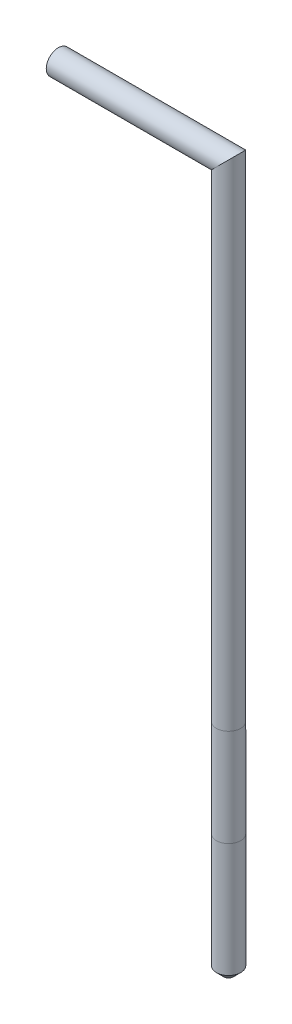
ISO-10303-21;
HEADER;
FILE_DESCRIPTION(('STEP AP214'),'2;1');
FILE_NAME('part.step','',(''),(''),'','','');
FILE_SCHEMA(('AUTOMOTIVE_DESIGN { 1 0 10303 214 1 1 1 1 }'));
ENDSEC;
DATA;
#1=APPLICATION_CONTEXT('core data for automotive mechanical design processes');
#2=APPLICATION_PROTOCOL_DEFINITION('international standard','automotive_design',2000,#1);
#3=PRODUCT_CONTEXT('',#1,'mechanical');
#4=PRODUCT('Part','Part','',(#3));
#5=PRODUCT_RELATED_PRODUCT_CATEGORY('part','',(#4));
#6=PRODUCT_DEFINITION_FORMATION('','',#4);
#7=PRODUCT_DEFINITION_CONTEXT('part definition',#1,'design');
#8=PRODUCT_DEFINITION('design','',#6,#7);
#9=PRODUCT_DEFINITION_SHAPE('','',#8);
#10=(LENGTH_UNIT() NAMED_UNIT(*) SI_UNIT(.MILLI.,.METRE.));
#11=(NAMED_UNIT(*) PLANE_ANGLE_UNIT() SI_UNIT($,.RADIAN.));
#12=(NAMED_UNIT(*) SI_UNIT($,.STERADIAN.) SOLID_ANGLE_UNIT());
#13=UNCERTAINTY_MEASURE_WITH_UNIT(LENGTH_MEASURE(1.E-05),#10,'distance_accuracy_value','');
#14=(GEOMETRIC_REPRESENTATION_CONTEXT(3) GLOBAL_UNCERTAINTY_ASSIGNED_CONTEXT((#13)) GLOBAL_UNIT_ASSIGNED_CONTEXT((#10,
#11,#12)) REPRESENTATION_CONTEXT('',''));
#15=CARTESIAN_POINT('',(0.,0.,0.));
#16=DIRECTION('',(0.,0.,1.));
#17=DIRECTION('',(1.,0.,0.));
#18=AXIS2_PLACEMENT_3D('',#15,#16,#17);
#19=CARTESIAN_POINT('',(0.,-50.,0.));
#20=DIRECTION('',(0.,1.,0.));
#21=DIRECTION('',(0.,0.,1.));
#22=AXIS2_PLACEMENT_3D('',#19,#20,#21);
#23=PLANE('',#22);
#24=CARTESIAN_POINT('',(0.,-50.,0.));
#25=DIRECTION('',(0.,1.,0.));
#26=DIRECTION('',(0.,0.,1.));
#27=AXIS2_PLACEMENT_3D('',#24,#25,#26);
#28=CIRCLE('',#27,2.);
#29=CARTESIAN_POINT('',(0.,-50.,2.));
#30=VERTEX_POINT('',#29);
#31=EDGE_CURVE('E10',#30,#30,#28,.F.);
#32=ORIENTED_EDGE('',*,*,#31,.T.);
#33=EDGE_LOOP('',(#32));
#34=FACE_BOUND('',#33,.T.);
#35=ADVANCED_FACE('F32',(#34),#23,.F.);
#36=CARTESIAN_POINT('',(-70.,240.,0.));
#37=DIRECTION('',(-1.,0.,0.));
#38=DIRECTION('',(0.,0.,1.));
#39=AXIS2_PLACEMENT_3D('',#36,#37,#38);
#40=PLANE('',#39);
#41=CARTESIAN_POINT('',(-70.,240.,0.));
#42=DIRECTION('',(-1.,0.,0.));
#43=DIRECTION('',(0.,0.,1.));
#44=AXIS2_PLACEMENT_3D('',#41,#42,#43);
#45=CIRCLE('',#44,5.);
#46=CARTESIAN_POINT('',(-70.,240.,5.));
#47=VERTEX_POINT('',#46);
#48=EDGE_CURVE('E48',#47,#47,#45,.T.);
#49=ORIENTED_EDGE('',*,*,#48,.T.);
#50=EDGE_LOOP('',(#49));
#51=FACE_BOUND('',#50,.T.);
#52=ADVANCED_FACE('F60',(#51),#40,.T.);
#53=CARTESIAN_POINT('',(0.,251.1,0.));
#54=DIRECTION('',(0.,-1.,0.));
#55=DIRECTION('',(0.,0.,-1.));
#56=AXIS2_PLACEMENT_3D('',#53,#54,#55);
#57=CYLINDRICAL_SURFACE('',#56,5.);
#58=CARTESIAN_POINT('',(0.,240.,0.));
#59=DIRECTION('',(0.707106781186548,-0.707106781186548,0.));
#60=DIRECTION('',(0.707106781186548,0.707106781186548,0.));
#61=AXIS2_PLACEMENT_3D('',#58,#59,#60);
#62=ELLIPSE('',#61,7.07106781186547,5.);
#63=CARTESIAN_POINT('',(5.,245.,0.));
#64=VERTEX_POINT('',#63);
#65=EDGE_CURVE('E44',#64,#64,#62,.T.);
#66=ORIENTED_EDGE('',*,*,#65,.T.);
#67=EDGE_LOOP('',(#66));
#68=FACE_BOUND('',#67,.T.);
#69=CARTESIAN_POINT('',(0.,40.,0.));
#70=DIRECTION('',(0.,1.,0.));
#71=DIRECTION('',(0.,0.,1.));
#72=AXIS2_PLACEMENT_3D('',#69,#70,#71);
#73=CIRCLE('',#72,5.);
#74=CARTESIAN_POINT('',(0.,40.,5.));
#75=VERTEX_POINT('',#74);
#76=EDGE_CURVE('E51',#75,#75,#73,.T.);
#77=ORIENTED_EDGE('',*,*,#76,.T.);
#78=EDGE_LOOP('',(#77));
#79=FACE_BOUND('',#78,.T.);
#80=ADVANCED_FACE('F69',(#68,#79),#57,.T.);
#81=CARTESIAN_POINT('',(0.,40.,0.));
#82=DIRECTION('',(0.,-1.,0.));
#83=DIRECTION('',(0.,0.,-1.));
#84=AXIS2_PLACEMENT_3D('',#81,#82,#83);
#85=CYLINDRICAL_SURFACE('',#84,5.);
#86=CARTESIAN_POINT('',(0.,0.,0.));
#87=DIRECTION('',(0.,1.,0.));
#88=DIRECTION('',(0.,0.,1.));
#89=AXIS2_PLACEMENT_3D('',#86,#87,#88);
#90=CIRCLE('',#89,5.);
#91=CARTESIAN_POINT('',(0.,0.,5.));
#92=VERTEX_POINT('',#91);
#93=EDGE_CURVE('E54',#92,#92,#90,.T.);
#94=ORIENTED_EDGE('',*,*,#93,.T.);
#95=EDGE_LOOP('',(#94));
#96=FACE_BOUND('',#95,.T.);
#97=ORIENTED_EDGE('',*,*,#76,.F.);
#98=EDGE_LOOP('',(#97));
#99=FACE_BOUND('',#98,.T.);
#100=ADVANCED_FACE('F72',(#96,#99),#85,.T.);
#101=CARTESIAN_POINT('',(0.,0.,0.));
#102=DIRECTION('',(0.,-1.,0.));
#103=DIRECTION('',(0.,0.,-1.));
#104=AXIS2_PLACEMENT_3D('',#101,#102,#103);
#105=CYLINDRICAL_SURFACE('',#104,5.);
#106=CARTESIAN_POINT('',(0.,-47.,0.));
#107=DIRECTION('',(0.,1.,0.));
#108=DIRECTION('',(0.,0.,1.));
#109=AXIS2_PLACEMENT_3D('',#106,#107,#108);
#110=CIRCLE('',#109,5.);
#111=CARTESIAN_POINT('',(0.,-47.,5.));
#112=VERTEX_POINT('',#111);
#113=EDGE_CURVE('E40',#112,#112,#110,.T.);
#114=ORIENTED_EDGE('',*,*,#113,.T.);
#115=EDGE_LOOP('',(#114));
#116=FACE_BOUND('',#115,.T.);
#117=ORIENTED_EDGE('',*,*,#93,.F.);
#118=EDGE_LOOP('',(#117));
#119=FACE_BOUND('',#118,.T.);
#120=ADVANCED_FACE('F65',(#116,#119),#105,.T.);
#121=CARTESIAN_POINT('',(-70.,240.,0.));
#122=DIRECTION('',(1.,0.,0.));
#123=DIRECTION('',(0.,0.,-1.));
#124=AXIS2_PLACEMENT_3D('',#121,#122,#123);
#125=CYLINDRICAL_SURFACE('',#124,5.);
#126=ORIENTED_EDGE('',*,*,#48,.F.);
#127=EDGE_LOOP('',(#126));
#128=FACE_BOUND('',#127,.T.);
#129=ORIENTED_EDGE('',*,*,#65,.F.);
#130=EDGE_LOOP('',(#129));
#131=FACE_BOUND('',#130,.T.);
#132=ADVANCED_FACE('F62',(#128,#131),#125,.T.);
#133=CARTESIAN_POINT('',(0.,-47.,0.));
#134=DIRECTION('',(0.,1.,0.));
#135=DIRECTION('',(0.,0.,1.));
#136=AXIS2_PLACEMENT_3D('',#133,#134,#135);
#137=CONICAL_SURFACE('',#136,5.,0.785398163397453);
#138=ORIENTED_EDGE('',*,*,#31,.F.);
#139=EDGE_LOOP('',(#138));
#140=FACE_BOUND('',#139,.T.);
#141=ORIENTED_EDGE('',*,*,#113,.F.);
#142=EDGE_LOOP('',(#141));
#143=FACE_BOUND('',#142,.T.);
#144=ADVANCED_FACE('F35',(#140,#143),#137,.T.);
#145=CLOSED_SHELL('',(#35,#52,#80,#100,#120,#132,#144));
#146=MANIFOLD_SOLID_BREP('B2',#145);
#147=ADVANCED_BREP_SHAPE_REPRESENTATION('',(#18,#146),#14);
#148=SHAPE_DEFINITION_REPRESENTATION(#9,#147);
ENDSEC;
END-ISO-10303-21;
